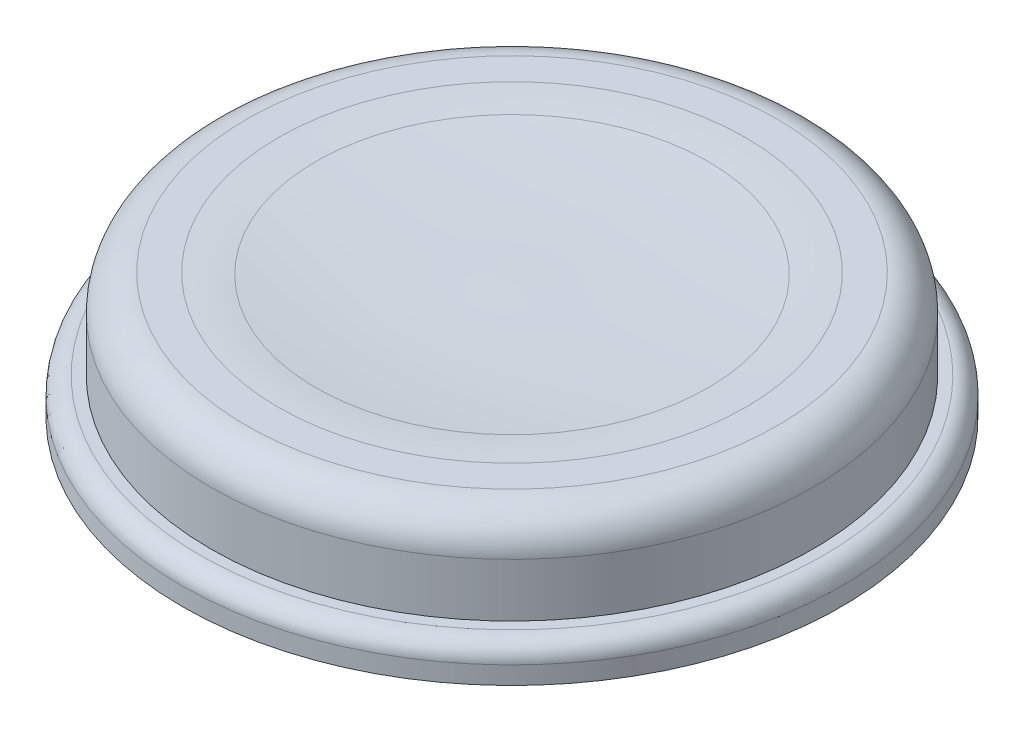
ISO-10303-21;
HEADER;
FILE_DESCRIPTION(('STEP AP214'),'2;1');
FILE_NAME('part.step','',(''),(''),'','','');
FILE_SCHEMA(('AUTOMOTIVE_DESIGN { 1 0 10303 214 1 1 1 1 }'));
ENDSEC;
DATA;
#1=APPLICATION_CONTEXT('core data for automotive mechanical design processes');
#2=APPLICATION_PROTOCOL_DEFINITION('international standard','automotive_design',2000,#1);
#3=PRODUCT_CONTEXT('',#1,'mechanical');
#4=PRODUCT('Part','Part','',(#3));
#5=PRODUCT_RELATED_PRODUCT_CATEGORY('part','',(#4));
#6=PRODUCT_DEFINITION_FORMATION('','',#4);
#7=PRODUCT_DEFINITION_CONTEXT('part definition',#1,'design');
#8=PRODUCT_DEFINITION('design','',#6,#7);
#9=PRODUCT_DEFINITION_SHAPE('','',#8);
#10=(LENGTH_UNIT() NAMED_UNIT(*) SI_UNIT(.MILLI.,.METRE.));
#11=(NAMED_UNIT(*) PLANE_ANGLE_UNIT() SI_UNIT($,.RADIAN.));
#12=(NAMED_UNIT(*) SI_UNIT($,.STERADIAN.) SOLID_ANGLE_UNIT());
#13=UNCERTAINTY_MEASURE_WITH_UNIT(LENGTH_MEASURE(1.E-05),#10,'distance_accuracy_value','');
#14=(GEOMETRIC_REPRESENTATION_CONTEXT(3) GLOBAL_UNCERTAINTY_ASSIGNED_CONTEXT((#13)) GLOBAL_UNIT_ASSIGNED_CONTEXT((#10,
#11,#12)) REPRESENTATION_CONTEXT('',''));
#15=CARTESIAN_POINT('',(0.,0.,0.));
#16=DIRECTION('',(0.,0.,1.));
#17=DIRECTION('',(1.,0.,0.));
#18=AXIS2_PLACEMENT_3D('',#15,#16,#17);
#19=CARTESIAN_POINT('',(0.,0.,0.));
#20=DIRECTION('',(0.,-1.,0.));
#21=DIRECTION('',(0.,0.,-1.));
#22=AXIS2_PLACEMENT_3D('',#19,#20,#21);
#23=CYLINDRICAL_SURFACE('',#22,14.5);
#24=CARTESIAN_POINT('',(0.,-0.999999999999974,0.));
#25=DIRECTION('',(0.,-1.,0.));
#26=DIRECTION('',(0.,0.,-1.));
#27=AXIS2_PLACEMENT_3D('',#24,#25,#26);
#28=CIRCLE('',#27,14.5);
#29=CARTESIAN_POINT('',(0.,-0.999999999999947,-14.5));
#30=VERTEX_POINT('',#29);
#31=EDGE_CURVE('E78',#30,#30,#28,.T.);
#32=ORIENTED_EDGE('',*,*,#31,.F.);
#33=EDGE_LOOP('',(#32));
#34=FACE_BOUND('',#33,.T.);
#35=CARTESIAN_POINT('',(0.,-1.99999999999997,0.));
#36=DIRECTION('',(0.,-1.,0.));
#37=DIRECTION('',(0.,0.,-1.));
#38=AXIS2_PLACEMENT_3D('',#35,#36,#37);
#39=CIRCLE('',#38,14.5);
#40=CARTESIAN_POINT('',(0.,-1.99999999999995,-14.5));
#41=VERTEX_POINT('',#40);
#42=EDGE_CURVE('E79',#41,#41,#39,.T.);
#43=ORIENTED_EDGE('',*,*,#42,.T.);
#44=EDGE_LOOP('',(#43));
#45=FACE_BOUND('',#44,.T.);
#46=ADVANCED_FACE('F39',(#34,#45),#23,.F.);
#47=CARTESIAN_POINT('',(0.,-0.999999999999975,0.));
#48=DIRECTION('',(0.,-1.,0.));
#49=DIRECTION('',(0.,0.,-1.));
#50=AXIS2_PLACEMENT_3D('',#47,#48,#49);
#51=TOROIDAL_SURFACE('',#50,13.5,1.);
#52=CARTESIAN_POINT('',(0.,0.,0.));
#53=DIRECTION('',(0.,-1.,0.));
#54=DIRECTION('',(0.,0.,-1.));
#55=AXIS2_PLACEMENT_3D('',#52,#53,#54);
#56=CIRCLE('',#55,13.5);
#57=CARTESIAN_POINT('',(0.,0.,-13.5));
#58=VERTEX_POINT('',#57);
#59=EDGE_CURVE('E110',#58,#58,#56,.T.);
#60=ORIENTED_EDGE('',*,*,#59,.F.);
#61=EDGE_LOOP('',(#60));
#62=FACE_BOUND('',#61,.T.);
#63=ORIENTED_EDGE('',*,*,#31,.T.);
#64=EDGE_LOOP('',(#63));
#65=FACE_BOUND('',#64,.T.);
#66=ADVANCED_FACE('F61',(#62,#65),#51,.F.);
#67=CARTESIAN_POINT('',(0.,0.,13.5));
#68=DIRECTION('',(0.,1.,0.));
#69=DIRECTION('',(0.,0.,1.));
#70=AXIS2_PLACEMENT_3D('',#67,#68,#69);
#71=PLANE('',#70);
#72=CARTESIAN_POINT('',(0.,0.,0.));
#73=DIRECTION('',(0.,1.,0.));
#74=DIRECTION('',(0.,0.,1.));
#75=AXIS2_PLACEMENT_3D('',#72,#73,#74);
#76=CIRCLE('',#75,4.);
#77=CARTESIAN_POINT('',(0.,0.,4.));
#78=VERTEX_POINT('',#77);
#79=EDGE_CURVE('E112',#78,#78,#76,.F.);
#80=ORIENTED_EDGE('',*,*,#79,.F.);
#81=EDGE_LOOP('',(#80));
#82=FACE_BOUND('',#81,.T.);
#83=ORIENTED_EDGE('',*,*,#59,.T.);
#84=EDGE_LOOP('',(#83));
#85=FACE_BOUND('',#84,.T.);
#86=ADVANCED_FACE('F55',(#82,#85),#71,.F.);
#87=CARTESIAN_POINT('',(0.,89.464097623842,-2.47024593233961));
#88=DIRECTION('',(-1.,0.,0.));
#89=DIRECTION('',(0.,0.,-1.));
#90=AXIS2_PLACEMENT_3D('',#87,#88,#89);
#91=CIRCLE('',#90,85.);
#92=TRIMMED_CURVE('',#91,(PARAMETER_VALUE(-1.59986213604205)),
(PARAMETER_VALUE(1.59986213604205)),.T.,.PARAMETER.);
#93=CARTESIAN_POINT('',(0.,89.464097623842,1.62196645003831E-13));
#94=DIRECTION('',(0.,-1.,0.));
#95=AXIS1_PLACEMENT('',#93,#94);
#96=SURFACE_OF_REVOLUTION('',#92,#95);
#97=CARTESIAN_POINT('',(0.,4.89383066132722,0.));
#98=DIRECTION('',(0.,-1.,0.));
#99=DIRECTION('',(0.,0.,-1.));
#100=AXIS2_PLACEMENT_3D('',#97,#98,#99);
#101=CIRCLE('',#100,11.0066354436598);
#102=CARTESIAN_POINT('',(0.,4.89383066132724,-11.0066354436598));
#103=VERTEX_POINT('',#102);
#104=EDGE_CURVE('E102',#103,#103,#101,.T.);
#105=ORIENTED_EDGE('',*,*,#104,.F.);
#106=EDGE_LOOP('',(#105));
#107=FACE_BOUND('',#106,.T.);
#108=CARTESIAN_POINT('',(0.,4.49999999999999,0.));
#109=VERTEX_POINT('',#108);
#110=VERTEX_LOOP('',#109);
#111=FACE_BOUND('',#110,.T.);
#112=ADVANCED_FACE('F47',(#107,#111),#96,.F.);
#113=CARTESIAN_POINT('',(0.,-16.,0.));
#114=DIRECTION('',(0.,-1.,0.));
#115=DIRECTION('',(0.,0.,-1.));
#116=AXIS2_PLACEMENT_3D('',#113,#114,#115);
#117=DEGENERATE_TOROIDAL_SURFACE('',#116,13.1156257935153,21.,.T.);
#118=CARTESIAN_POINT('',(0.,5.00000000000002,0.));
#119=DIRECTION('',(0.,-1.,0.));
#120=DIRECTION('',(0.,0.,-1.));
#121=AXIS2_PLACEMENT_3D('',#118,#119,#120);
#122=CIRCLE('',#121,13.1156257935153);
#123=CARTESIAN_POINT('',(0.,5.00000000000005,-13.1156257935153));
#124=VERTEX_POINT('',#123);
#125=EDGE_CURVE('E101',#124,#124,#122,.T.);
#126=ORIENTED_EDGE('',*,*,#125,.F.);
#127=EDGE_LOOP('',(#126));
#128=FACE_BOUND('',#127,.T.);
#129=ORIENTED_EDGE('',*,*,#104,.T.);
#130=EDGE_LOOP('',(#129));
#131=FACE_BOUND('',#130,.T.);
#132=ADVANCED_FACE('F51',(#128,#131),#117,.T.);
#133=CARTESIAN_POINT('',(0.,5.,14.9));
#134=DIRECTION('',(0.,-1.,0.));
#135=DIRECTION('',(0.,0.,-1.));
#136=AXIS2_PLACEMENT_3D('',#133,#134,#135);
#137=PLANE('',#136);
#138=CARTESIAN_POINT('',(0.,5.00000000000003,0.));
#139=DIRECTION('',(0.,-1.,0.));
#140=DIRECTION('',(0.,0.,-1.));
#141=AXIS2_PLACEMENT_3D('',#138,#139,#140);
#142=CIRCLE('',#141,14.9);
#143=CARTESIAN_POINT('',(0.,5.00000000000005,-14.9));
#144=VERTEX_POINT('',#143);
#145=EDGE_CURVE('E98',#144,#144,#142,.T.);
#146=ORIENTED_EDGE('',*,*,#145,.F.);
#147=EDGE_LOOP('',(#146));
#148=FACE_BOUND('',#147,.T.);
#149=ORIENTED_EDGE('',*,*,#125,.T.);
#150=EDGE_LOOP('',(#149));
#151=FACE_BOUND('',#150,.T.);
#152=ADVANCED_FACE('F56',(#148,#151),#137,.F.);
#153=CARTESIAN_POINT('',(0.,3.00000000000003,0.));
#154=DIRECTION('',(0.,-1.,0.));
#155=DIRECTION('',(0.,0.,-1.));
#156=AXIS2_PLACEMENT_3D('',#153,#154,#155);
#157=TOROIDAL_SURFACE('',#156,14.9,2.);
#158=CARTESIAN_POINT('',(0.,3.00000000000003,0.));
#159=DIRECTION('',(0.,-1.,0.));
#160=DIRECTION('',(0.,0.,-1.));
#161=AXIS2_PLACEMENT_3D('',#158,#159,#160);
#162=CIRCLE('',#161,16.9);
#163=CARTESIAN_POINT('',(0.,3.00000000000006,-16.9));
#164=VERTEX_POINT('',#163);
#165=EDGE_CURVE('E92',#164,#164,#162,.T.);
#166=ORIENTED_EDGE('',*,*,#165,.F.);
#167=EDGE_LOOP('',(#166));
#168=FACE_BOUND('',#167,.T.);
#169=ORIENTED_EDGE('',*,*,#145,.T.);
#170=EDGE_LOOP('',(#169));
#171=FACE_BOUND('',#170,.T.);
#172=ADVANCED_FACE('F154',(#168,#171),#157,.T.);
#173=CARTESIAN_POINT('',(0.,0.,0.));
#174=DIRECTION('',(0.,-1.,0.));
#175=DIRECTION('',(0.,0.,-1.));
#176=AXIS2_PLACEMENT_3D('',#173,#174,#175);
#177=CYLINDRICAL_SURFACE('',#176,16.9);
#178=CARTESIAN_POINT('',(0.,0.,0.));
#179=DIRECTION('',(0.,-1.,0.));
#180=DIRECTION('',(0.,0.,-1.));
#181=AXIS2_PLACEMENT_3D('',#178,#179,#180);
#182=CIRCLE('',#181,16.9);
#183=CARTESIAN_POINT('',(0.,0.,-16.9));
#184=VERTEX_POINT('',#183);
#185=EDGE_CURVE('E95',#184,#184,#182,.T.);
#186=ORIENTED_EDGE('',*,*,#185,.F.);
#187=EDGE_LOOP('',(#186));
#188=FACE_BOUND('',#187,.T.);
#189=ORIENTED_EDGE('',*,*,#165,.T.);
#190=EDGE_LOOP('',(#189));
#191=FACE_BOUND('',#190,.T.);
#192=ADVANCED_FACE('F151',(#188,#191),#177,.T.);
#193=CARTESIAN_POINT('',(0.,0.,17.5));
#194=DIRECTION('',(0.,-1.,0.));
#195=DIRECTION('',(0.,0.,-1.));
#196=AXIS2_PLACEMENT_3D('',#193,#194,#195);
#197=PLANE('',#196);
#198=CARTESIAN_POINT('',(0.,0.,0.));
#199=DIRECTION('',(0.,-1.,0.));
#200=DIRECTION('',(0.,0.,-1.));
#201=AXIS2_PLACEMENT_3D('',#198,#199,#200);
#202=CIRCLE('',#201,17.5);
#203=CARTESIAN_POINT('',(0.,0.,-17.5));
#204=VERTEX_POINT('',#203);
#205=EDGE_CURVE('E90',#204,#204,#202,.T.);
#206=ORIENTED_EDGE('',*,*,#205,.F.);
#207=EDGE_LOOP('',(#206));
#208=FACE_BOUND('',#207,.T.);
#209=ORIENTED_EDGE('',*,*,#185,.T.);
#210=EDGE_LOOP('',(#209));
#211=FACE_BOUND('',#210,.T.);
#212=ADVANCED_FACE('F150',(#208,#211),#197,.F.);
#213=CARTESIAN_POINT('',(0.,-0.999999999999968,0.));
#214=DIRECTION('',(0.,-1.,0.));
#215=DIRECTION('',(0.,0.,-1.));
#216=AXIS2_PLACEMENT_3D('',#213,#214,#215);
#217=TOROIDAL_SURFACE('',#216,17.5,1.);
#218=CARTESIAN_POINT('',(0.,-0.999999999999967,0.));
#219=DIRECTION('',(0.,-1.,0.));
#220=DIRECTION('',(0.,0.,-1.));
#221=AXIS2_PLACEMENT_3D('',#218,#219,#220);
#222=CIRCLE('',#221,18.5);
#223=CARTESIAN_POINT('',(0.,-0.999999999999933,-18.5));
#224=VERTEX_POINT('',#223);
#225=EDGE_CURVE('E84',#224,#224,#222,.T.);
#226=ORIENTED_EDGE('',*,*,#225,.F.);
#227=EDGE_LOOP('',(#226));
#228=FACE_BOUND('',#227,.T.);
#229=ORIENTED_EDGE('',*,*,#205,.T.);
#230=EDGE_LOOP('',(#229));
#231=FACE_BOUND('',#230,.T.);
#232=ADVANCED_FACE('F141',(#228,#231),#217,.T.);
#233=CARTESIAN_POINT('',(0.,0.,0.));
#234=DIRECTION('',(0.,-1.,0.));
#235=DIRECTION('',(0.,0.,-1.));
#236=AXIS2_PLACEMENT_3D('',#233,#234,#235);
#237=CYLINDRICAL_SURFACE('',#236,18.5);
#238=CARTESIAN_POINT('',(0.,-1.99999999999997,0.));
#239=DIRECTION('',(0.,-1.,0.));
#240=DIRECTION('',(0.,0.,-1.));
#241=AXIS2_PLACEMENT_3D('',#238,#239,#240);
#242=CIRCLE('',#241,18.5);
#243=CARTESIAN_POINT('',(0.,-1.99999999999993,-18.5));
#244=VERTEX_POINT('',#243);
#245=EDGE_CURVE('E82',#244,#244,#242,.T.);
#246=ORIENTED_EDGE('',*,*,#245,.F.);
#247=EDGE_LOOP('',(#246));
#248=FACE_BOUND('',#247,.T.);
#249=ORIENTED_EDGE('',*,*,#225,.T.);
#250=EDGE_LOOP('',(#249));
#251=FACE_BOUND('',#250,.T.);
#252=ADVANCED_FACE('F138',(#248,#251),#237,.T.);
#253=CARTESIAN_POINT('',(0.,-2.,18.5));
#254=DIRECTION('',(0.,1.,0.));
#255=DIRECTION('',(0.,0.,1.));
#256=AXIS2_PLACEMENT_3D('',#253,#254,#255);
#257=PLANE('',#256);
#258=ORIENTED_EDGE('',*,*,#42,.F.);
#259=EDGE_LOOP('',(#258));
#260=FACE_BOUND('',#259,.T.);
#261=ORIENTED_EDGE('',*,*,#245,.T.);
#262=EDGE_LOOP('',(#261));
#263=FACE_BOUND('',#262,.T.);
#264=ADVANCED_FACE('F129',(#260,#263),#257,.F.);
#265=CARTESIAN_POINT('',(0.,-3.6,0.));
#266=DIRECTION('',(0.,1.,0.));
#267=DIRECTION('',(0.,0.,1.));
#268=AXIS2_PLACEMENT_3D('',#265,#266,#267);
#269=CYLINDRICAL_SURFACE('',#268,4.);
#270=CARTESIAN_POINT('',(0.,-2.6,0.));
#271=DIRECTION('',(0.,-1.,0.));
#272=DIRECTION('',(0.,0.,-1.));
#273=AXIS2_PLACEMENT_3D('',#270,#271,#272);
#274=CIRCLE('',#273,4.);
#275=CARTESIAN_POINT('',(0.,-2.6,-4.));
#276=VERTEX_POINT('',#275);
#277=EDGE_CURVE('E11',#276,#276,#274,.F.);
#278=ORIENTED_EDGE('',*,*,#277,.T.);
#279=EDGE_LOOP('',(#278));
#280=FACE_BOUND('',#279,.T.);
#281=ORIENTED_EDGE('',*,*,#79,.T.);
#282=EDGE_LOOP('',(#281));
#283=FACE_BOUND('',#282,.T.);
#284=ADVANCED_FACE('F123',(#280,#283),#269,.T.);
#285=CARTESIAN_POINT('',(0.,-3.6,0.));
#286=DIRECTION('',(0.,-1.,0.));
#287=DIRECTION('',(0.,0.,-1.));
#288=AXIS2_PLACEMENT_3D('',#285,#286,#287);
#289=PLANE('',#288);
#290=CARTESIAN_POINT('',(0.,-3.6,0.));
#291=DIRECTION('',(0.,-1.,0.));
#292=DIRECTION('',(0.,0.,-1.));
#293=AXIS2_PLACEMENT_3D('',#290,#291,#292);
#294=CIRCLE('',#293,3.);
#295=CARTESIAN_POINT('',(0.,-3.6,-3.));
#296=VERTEX_POINT('',#295);
#297=EDGE_CURVE('E46',#296,#296,#294,.T.);
#298=ORIENTED_EDGE('',*,*,#297,.T.);
#299=EDGE_LOOP('',(#298));
#300=FACE_BOUND('',#299,.T.);
#301=ADVANCED_FACE('F118',(#300),#289,.T.);
#302=CARTESIAN_POINT('',(0.,-2.6,0.));
#303=DIRECTION('',(0.,-1.,0.));
#304=DIRECTION('',(0.,0.,-1.));
#305=AXIS2_PLACEMENT_3D('',#302,#303,#304);
#306=TOROIDAL_SURFACE('',#305,3.,1.);
#307=ORIENTED_EDGE('',*,*,#277,.F.);
#308=EDGE_LOOP('',(#307));
#309=FACE_BOUND('',#308,.T.);
#310=ORIENTED_EDGE('',*,*,#297,.F.);
#311=EDGE_LOOP('',(#310));
#312=FACE_BOUND('',#311,.T.);
#313=ADVANCED_FACE('F41',(#309,#312),#306,.T.);
#314=CLOSED_SHELL('',(#46,#66,#86,#112,#132,#152,#172,#192,#212,#232,#252,#264,#284,#301,#313));
#315=MANIFOLD_SOLID_BREP('B2',#314);
#316=ADVANCED_BREP_SHAPE_REPRESENTATION('',(#18,#315),#14);
#317=SHAPE_DEFINITION_REPRESENTATION(#9,#316);
ENDSEC;
END-ISO-10303-21;
